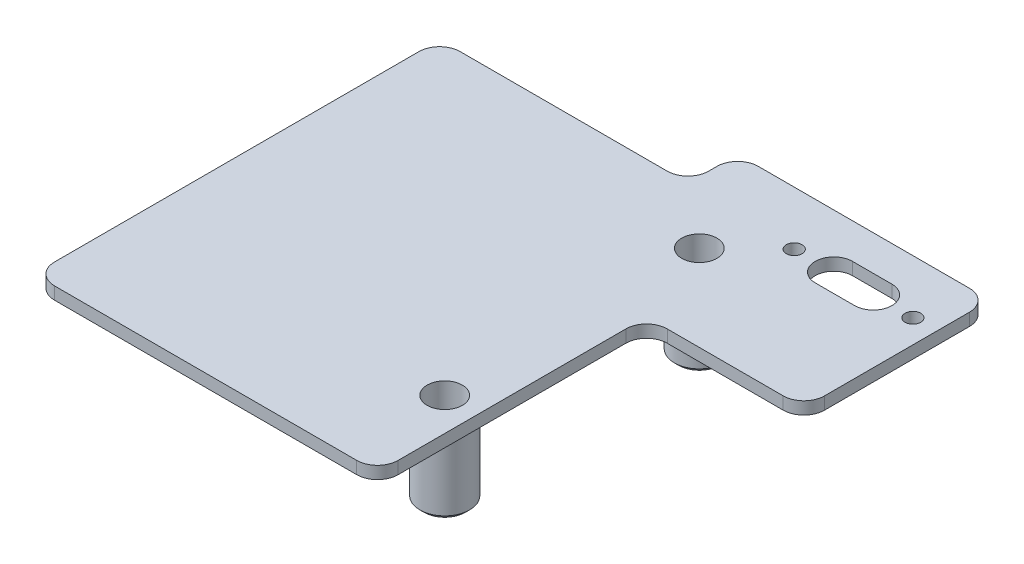
ISO-10303-21;
HEADER;
FILE_DESCRIPTION(('STEP AP214'),'2;1');
FILE_NAME('part.step','',(''),(''),'','','');
FILE_SCHEMA(('AUTOMOTIVE_DESIGN { 1 0 10303 214 1 1 1 1 }'));
ENDSEC;
DATA;
#1=APPLICATION_CONTEXT('core data for automotive mechanical design processes');
#2=APPLICATION_PROTOCOL_DEFINITION('international standard','automotive_design',2000,#1);
#3=PRODUCT_CONTEXT('',#1,'mechanical');
#4=PRODUCT('Part','Part','',(#3));
#5=PRODUCT_RELATED_PRODUCT_CATEGORY('part','',(#4));
#6=PRODUCT_DEFINITION_FORMATION('','',#4);
#7=PRODUCT_DEFINITION_CONTEXT('part definition',#1,'design');
#8=PRODUCT_DEFINITION('design','',#6,#7);
#9=PRODUCT_DEFINITION_SHAPE('','',#8);
#10=(LENGTH_UNIT() NAMED_UNIT(*) SI_UNIT(.MILLI.,.METRE.));
#11=(NAMED_UNIT(*) PLANE_ANGLE_UNIT() SI_UNIT($,.RADIAN.));
#12=(NAMED_UNIT(*) SI_UNIT($,.STERADIAN.) SOLID_ANGLE_UNIT());
#13=UNCERTAINTY_MEASURE_WITH_UNIT(LENGTH_MEASURE(1.E-05),#10,'distance_accuracy_value','');
#14=(GEOMETRIC_REPRESENTATION_CONTEXT(3) GLOBAL_UNCERTAINTY_ASSIGNED_CONTEXT((#13)) GLOBAL_UNIT_ASSIGNED_CONTEXT((#10,
#11,#12)) REPRESENTATION_CONTEXT('',''));
#15=CARTESIAN_POINT('',(0.,0.,0.));
#16=DIRECTION('',(0.,0.,1.));
#17=DIRECTION('',(1.,0.,0.));
#18=AXIS2_PLACEMENT_3D('',#15,#16,#17);
#19=CARTESIAN_POINT('',(0.,3.,-110.));
#20=DIRECTION('',(1.,0.,0.));
#21=DIRECTION('',(0.,0.,-1.));
#22=AXIS2_PLACEMENT_3D('',#19,#20,#21);
#23=PLANE('',#22);
#24=DIRECTION('',(0.,0.,1.));
#25=VECTOR('',#24,1.);
#26=CARTESIAN_POINT('',(0.,3.,-110.));
#27=LINE('',#26,#25);
#28=CARTESIAN_POINT('',(0.,3.,-93.));
#29=VERTEX_POINT('',#28);
#30=CARTESIAN_POINT('',(0.,3.,-5.));
#31=VERTEX_POINT('',#30);
#32=EDGE_CURVE('E229',#29,#31,#27,.T.);
#33=ORIENTED_EDGE('',*,*,#32,.F.);
#34=DIRECTION('',(0.,1.,0.));
#35=VECTOR('',#34,1.);
#36=CARTESIAN_POINT('',(0.,3.,-93.));
#37=LINE('',#36,#35);
#38=CARTESIAN_POINT('',(0.,0.,-93.));
#39=VERTEX_POINT('',#38);
#40=EDGE_CURVE('E57',#29,#39,#37,.F.);
#41=ORIENTED_EDGE('',*,*,#40,.T.);
#42=DIRECTION('',(0.,0.,1.));
#43=VECTOR('',#42,1.);
#44=CARTESIAN_POINT('',(0.,0.,-110.));
#45=LINE('',#44,#43);
#46=CARTESIAN_POINT('',(0.,0.,-5.));
#47=VERTEX_POINT('',#46);
#48=EDGE_CURVE('E226',#39,#47,#45,.T.);
#49=ORIENTED_EDGE('',*,*,#48,.T.);
#50=DIRECTION('',(0.,-1.,0.));
#51=VECTOR('',#50,1.);
#52=CARTESIAN_POINT('',(0.,3.,-5.));
#53=LINE('',#52,#51);
#54=EDGE_CURVE('E357',#47,#31,#53,.F.);
#55=ORIENTED_EDGE('',*,*,#54,.T.);
#56=EDGE_LOOP('',(#33,#41,#49,#55));
#57=FACE_BOUND('',#56,.T.);
#58=ADVANCED_FACE('F35',(#57),#23,.F.);
#59=CARTESIAN_POINT('',(0.,3.,0.));
#60=DIRECTION('',(0.,0.,-1.));
#61=DIRECTION('',(-1.,0.,0.));
#62=AXIS2_PLACEMENT_3D('',#59,#60,#61);
#63=PLANE('',#62);
#64=DIRECTION('',(1.,0.,0.));
#65=VECTOR('',#64,1.);
#66=CARTESIAN_POINT('',(0.,0.,0.));
#67=LINE('',#66,#65);
#68=CARTESIAN_POINT('',(5.,0.,0.));
#69=VERTEX_POINT('',#68);
#70=CARTESIAN_POINT('',(78.,0.,0.));
#71=VERTEX_POINT('',#70);
#72=EDGE_CURVE('E250',#69,#71,#67,.T.);
#73=ORIENTED_EDGE('',*,*,#72,.T.);
#74=DIRECTION('',(0.,-1.,0.));
#75=VECTOR('',#74,1.);
#76=CARTESIAN_POINT('',(78.,3.,0.));
#77=LINE('',#76,#75);
#78=CARTESIAN_POINT('',(78.,3.,0.));
#79=VERTEX_POINT('',#78);
#80=EDGE_CURVE('E378',#71,#79,#77,.F.);
#81=ORIENTED_EDGE('',*,*,#80,.T.);
#82=DIRECTION('',(1.,0.,0.));
#83=VECTOR('',#82,1.);
#84=CARTESIAN_POINT('',(0.,3.,0.));
#85=LINE('',#84,#83);
#86=CARTESIAN_POINT('',(5.,3.,0.));
#87=VERTEX_POINT('',#86);
#88=EDGE_CURVE('E232',#87,#79,#85,.T.);
#89=ORIENTED_EDGE('',*,*,#88,.F.);
#90=DIRECTION('',(0.,-1.,0.));
#91=VECTOR('',#90,1.);
#92=CARTESIAN_POINT('',(5.,3.,0.));
#93=LINE('',#92,#91);
#94=EDGE_CURVE('E375',#87,#69,#93,.T.);
#95=ORIENTED_EDGE('',*,*,#94,.T.);
#96=EDGE_LOOP('',(#73,#81,#89,#95));
#97=FACE_BOUND('',#96,.T.);
#98=ADVANCED_FACE('F468',(#97),#63,.F.);
#99=CARTESIAN_POINT('',(83.,3.,0.));
#100=DIRECTION('',(-1.,0.,0.));
#101=DIRECTION('',(0.,0.,1.));
#102=AXIS2_PLACEMENT_3D('',#99,#100,#101);
#103=PLANE('',#102);
#104=DIRECTION('',(0.,0.,-1.));
#105=VECTOR('',#104,1.);
#106=CARTESIAN_POINT('',(83.,0.,0.));
#107=LINE('',#106,#105);
#108=CARTESIAN_POINT('',(83.,0.,-5.));
#109=VERTEX_POINT('',#108);
#110=CARTESIAN_POINT('',(83.,0.,-60.));
#111=VERTEX_POINT('',#110);
#112=EDGE_CURVE('E253',#109,#111,#107,.T.);
#113=ORIENTED_EDGE('',*,*,#112,.T.);
#114=DIRECTION('',(0.,-1.,0.));
#115=VECTOR('',#114,1.);
#116=CARTESIAN_POINT('',(83.,3.,-60.));
#117=LINE('',#116,#115);
#118=CARTESIAN_POINT('',(83.,3.,-60.));
#119=VERTEX_POINT('',#118);
#120=EDGE_CURVE('E373',#111,#119,#117,.F.);
#121=ORIENTED_EDGE('',*,*,#120,.T.);
#122=DIRECTION('',(0.,0.,-1.));
#123=VECTOR('',#122,1.);
#124=CARTESIAN_POINT('',(83.,3.,0.));
#125=LINE('',#124,#123);
#126=CARTESIAN_POINT('',(83.,3.,-5.));
#127=VERTEX_POINT('',#126);
#128=EDGE_CURVE('E236',#127,#119,#125,.T.);
#129=ORIENTED_EDGE('',*,*,#128,.F.);
#130=DIRECTION('',(0.,-1.,0.));
#131=VECTOR('',#130,1.);
#132=CARTESIAN_POINT('',(83.,3.,-5.));
#133=LINE('',#132,#131);
#134=EDGE_CURVE('E370',#127,#109,#133,.T.);
#135=ORIENTED_EDGE('',*,*,#134,.T.);
#136=EDGE_LOOP('',(#113,#121,#129,#135));
#137=FACE_BOUND('',#136,.T.);
#138=ADVANCED_FACE('F460',(#137),#103,.F.);
#139=CARTESIAN_POINT('',(83.,3.,-65.));
#140=DIRECTION('',(0.,0.,-1.));
#141=DIRECTION('',(-1.,0.,0.));
#142=AXIS2_PLACEMENT_3D('',#139,#140,#141);
#143=PLANE('',#142);
#144=DIRECTION('',(1.,0.,0.));
#145=VECTOR('',#144,1.);
#146=CARTESIAN_POINT('',(83.,0.,-65.));
#147=LINE('',#146,#145);
#148=CARTESIAN_POINT('',(88.,0.,-65.));
#149=VERTEX_POINT('',#148);
#150=CARTESIAN_POINT('',(116.,0.,-65.));
#151=VERTEX_POINT('',#150);
#152=EDGE_CURVE('E256',#149,#151,#147,.T.);
#153=ORIENTED_EDGE('',*,*,#152,.T.);
#154=DIRECTION('',(0.,-1.,0.));
#155=VECTOR('',#154,1.);
#156=CARTESIAN_POINT('',(116.,3.,-65.));
#157=LINE('',#156,#155);
#158=CARTESIAN_POINT('',(116.,3.,-65.));
#159=VERTEX_POINT('',#158);
#160=EDGE_CURVE('E368',#151,#159,#157,.F.);
#161=ORIENTED_EDGE('',*,*,#160,.T.);
#162=DIRECTION('',(1.,0.,0.));
#163=VECTOR('',#162,1.);
#164=CARTESIAN_POINT('',(83.,3.,-65.));
#165=LINE('',#164,#163);
#166=CARTESIAN_POINT('',(88.,3.,-65.));
#167=VERTEX_POINT('',#166);
#168=EDGE_CURVE('E239',#167,#159,#165,.T.);
#169=ORIENTED_EDGE('',*,*,#168,.F.);
#170=DIRECTION('',(0.,-1.,0.));
#171=VECTOR('',#170,1.);
#172=CARTESIAN_POINT('',(88.,0.,-65.));
#173=LINE('',#172,#171);
#174=EDGE_CURVE('E365',#167,#149,#173,.T.);
#175=ORIENTED_EDGE('',*,*,#174,.T.);
#176=EDGE_LOOP('',(#153,#161,#169,#175));
#177=FACE_BOUND('',#176,.T.);
#178=ADVANCED_FACE('F451',(#177),#143,.F.);
#179=CARTESIAN_POINT('',(121.,3.,-65.));
#180=DIRECTION('',(-1.,0.,0.));
#181=DIRECTION('',(0.,0.,1.));
#182=AXIS2_PLACEMENT_3D('',#179,#180,#181);
#183=PLANE('',#182);
#184=DIRECTION('',(0.,0.,-1.));
#185=VECTOR('',#184,1.);
#186=CARTESIAN_POINT('',(121.,0.,-65.));
#187=LINE('',#186,#185);
#188=CARTESIAN_POINT('',(121.,0.,-70.));
#189=VERTEX_POINT('',#188);
#190=CARTESIAN_POINT('',(121.,0.,-105.));
#191=VERTEX_POINT('',#190);
#192=EDGE_CURVE('E259',#189,#191,#187,.T.);
#193=ORIENTED_EDGE('',*,*,#192,.T.);
#194=DIRECTION('',(0.,-1.,0.));
#195=VECTOR('',#194,1.);
#196=CARTESIAN_POINT('',(121.,3.,-105.));
#197=LINE('',#196,#195);
#198=CARTESIAN_POINT('',(121.,3.,-105.));
#199=VERTEX_POINT('',#198);
#200=EDGE_CURVE('E363',#191,#199,#197,.F.);
#201=ORIENTED_EDGE('',*,*,#200,.T.);
#202=DIRECTION('',(0.,0.,-1.));
#203=VECTOR('',#202,1.);
#204=CARTESIAN_POINT('',(121.,3.,-65.));
#205=LINE('',#204,#203);
#206=CARTESIAN_POINT('',(121.,3.,-70.));
#207=VERTEX_POINT('',#206);
#208=EDGE_CURVE('E242',#207,#199,#205,.T.);
#209=ORIENTED_EDGE('',*,*,#208,.F.);
#210=DIRECTION('',(0.,-1.,0.));
#211=VECTOR('',#210,1.);
#212=CARTESIAN_POINT('',(121.,3.,-70.));
#213=LINE('',#212,#211);
#214=EDGE_CURVE('E360',#207,#189,#213,.T.);
#215=ORIENTED_EDGE('',*,*,#214,.T.);
#216=EDGE_LOOP('',(#193,#201,#209,#215));
#217=FACE_BOUND('',#216,.T.);
#218=ADVANCED_FACE('F443',(#217),#183,.F.);
#219=CARTESIAN_POINT('',(121.,3.,-110.));
#220=DIRECTION('',(0.,0.,1.));
#221=DIRECTION('',(1.,0.,0.));
#222=AXIS2_PLACEMENT_3D('',#219,#220,#221);
#223=PLANE('',#222);
#224=DIRECTION('',(-1.,0.,0.));
#225=VECTOR('',#224,1.);
#226=CARTESIAN_POINT('',(121.,0.,-110.));
#227=LINE('',#226,#225);
#228=CARTESIAN_POINT('',(116.,0.,-110.));
#229=VERTEX_POINT('',#228);
#230=CARTESIAN_POINT('',(65.,0.,-110.));
#231=VERTEX_POINT('',#230);
#232=EDGE_CURVE('E233',#229,#231,#227,.T.);
#233=ORIENTED_EDGE('',*,*,#232,.T.);
#234=DIRECTION('',(0.,1.,0.));
#235=VECTOR('',#234,1.);
#236=CARTESIAN_POINT('',(65.,3.,-110.));
#237=LINE('',#236,#235);
#238=CARTESIAN_POINT('',(65.,3.,-110.));
#239=VERTEX_POINT('',#238);
#240=EDGE_CURVE('E321',#231,#239,#237,.T.);
#241=ORIENTED_EDGE('',*,*,#240,.T.);
#242=DIRECTION('',(-1.,0.,0.));
#243=VECTOR('',#242,1.);
#244=CARTESIAN_POINT('',(121.,3.,-110.));
#245=LINE('',#244,#243);
#246=CARTESIAN_POINT('',(116.,3.,-110.));
#247=VERTEX_POINT('',#246);
#248=EDGE_CURVE('E245',#247,#239,#245,.T.);
#249=ORIENTED_EDGE('',*,*,#248,.F.);
#250=DIRECTION('',(0.,-1.,0.));
#251=VECTOR('',#250,1.);
#252=CARTESIAN_POINT('',(116.,3.,-110.));
#253=LINE('',#252,#251);
#254=EDGE_CURVE('E318',#247,#229,#253,.T.);
#255=ORIENTED_EDGE('',*,*,#254,.T.);
#256=EDGE_LOOP('',(#233,#241,#249,#255));
#257=FACE_BOUND('',#256,.T.);
#258=ADVANCED_FACE('F430',(#257),#223,.F.);
#259=CARTESIAN_POINT('',(0.,3.,0.));
#260=DIRECTION('',(0.,1.,0.));
#261=DIRECTION('',(0.,0.,1.));
#262=AXIS2_PLACEMENT_3D('',#259,#260,#261);
#263=PLANE('',#262);
#264=ORIENTED_EDGE('',*,*,#248,.T.);
#265=CARTESIAN_POINT('',(65.,3.,-105.));
#266=DIRECTION('',(0.,1.,0.));
#267=DIRECTION('',(0.,0.,1.));
#268=AXIS2_PLACEMENT_3D('',#265,#266,#267);
#269=CIRCLE('',#268,5.);
#270=CARTESIAN_POINT('',(60.,3.,-105.));
#271=VERTEX_POINT('',#270);
#272=EDGE_CURVE('E334',#239,#271,#269,.T.);
#273=ORIENTED_EDGE('',*,*,#272,.T.);
#274=DIRECTION('',(0.,0.,-1.));
#275=VECTOR('',#274,1.);
#276=CARTESIAN_POINT('',(60.,3.,-98.));
#277=LINE('',#276,#275);
#278=CARTESIAN_POINT('',(60.,3.,-103.));
#279=VERTEX_POINT('',#278);
#280=EDGE_CURVE('E488',#279,#271,#277,.T.);
#281=ORIENTED_EDGE('',*,*,#280,.F.);
#282=CARTESIAN_POINT('',(55.,3.,-103.));
#283=DIRECTION('',(0.,1.,0.));
#284=DIRECTION('',(0.,0.,1.));
#285=AXIS2_PLACEMENT_3D('',#282,#283,#284);
#286=CIRCLE('',#285,5.);
#287=CARTESIAN_POINT('',(55.,3.,-98.));
#288=VERTEX_POINT('',#287);
#289=EDGE_CURVE('E380',#279,#288,#286,.F.);
#290=ORIENTED_EDGE('',*,*,#289,.T.);
#291=DIRECTION('',(1.,0.,0.));
#292=VECTOR('',#291,1.);
#293=CARTESIAN_POINT('',(0.,3.,-98.));
#294=LINE('',#293,#292);
#295=CARTESIAN_POINT('',(4.99999999999999,3.,-98.));
#296=VERTEX_POINT('',#295);
#297=EDGE_CURVE('E476',#296,#288,#294,.T.);
#298=ORIENTED_EDGE('',*,*,#297,.F.);
#299=CARTESIAN_POINT('',(4.99999999999999,3.,-93.));
#300=DIRECTION('',(0.,1.,0.));
#301=DIRECTION('',(0.,0.,1.));
#302=AXIS2_PLACEMENT_3D('',#299,#300,#301);
#303=CIRCLE('',#302,5.);
#304=EDGE_CURVE('E332',#296,#29,#303,.T.);
#305=ORIENTED_EDGE('',*,*,#304,.T.);
#306=ORIENTED_EDGE('',*,*,#32,.T.);
#307=CARTESIAN_POINT('',(5.,3.,-5.));
#308=DIRECTION('',(0.,1.,0.));
#309=DIRECTION('',(0.,0.,1.));
#310=AXIS2_PLACEMENT_3D('',#307,#308,#309);
#311=CIRCLE('',#310,5.);
#312=EDGE_CURVE('E324',#31,#87,#311,.T.);
#313=ORIENTED_EDGE('',*,*,#312,.T.);
#314=ORIENTED_EDGE('',*,*,#88,.T.);
#315=CARTESIAN_POINT('',(78.,3.,-5.));
#316=DIRECTION('',(0.,1.,0.));
#317=DIRECTION('',(0.,0.,1.));
#318=AXIS2_PLACEMENT_3D('',#315,#316,#317);
#319=CIRCLE('',#318,5.);
#320=EDGE_CURVE('E326',#79,#127,#319,.T.);
#321=ORIENTED_EDGE('',*,*,#320,.T.);
#322=ORIENTED_EDGE('',*,*,#128,.T.);
#323=CARTESIAN_POINT('',(88.,3.,-60.));
#324=DIRECTION('',(0.,1.,0.));
#325=DIRECTION('',(0.,0.,1.));
#326=AXIS2_PLACEMENT_3D('',#323,#324,#325);
#327=CIRCLE('',#326,5.);
#328=EDGE_CURVE('E386',#119,#167,#327,.F.);
#329=ORIENTED_EDGE('',*,*,#328,.T.);
#330=ORIENTED_EDGE('',*,*,#168,.T.);
#331=CARTESIAN_POINT('',(116.,3.,-70.));
#332=DIRECTION('',(0.,1.,0.));
#333=DIRECTION('',(0.,0.,1.));
#334=AXIS2_PLACEMENT_3D('',#331,#332,#333);
#335=CIRCLE('',#334,5.);
#336=EDGE_CURVE('E328',#159,#207,#335,.T.);
#337=ORIENTED_EDGE('',*,*,#336,.T.);
#338=ORIENTED_EDGE('',*,*,#208,.T.);
#339=CARTESIAN_POINT('',(116.,3.,-105.));
#340=DIRECTION('',(0.,1.,0.));
#341=DIRECTION('',(0.,0.,1.));
#342=AXIS2_PLACEMENT_3D('',#339,#340,#341);
#343=CIRCLE('',#342,5.);
#344=EDGE_CURVE('E330',#199,#247,#343,.T.);
#345=ORIENTED_EDGE('',*,*,#344,.T.);
#346=EDGE_LOOP('',(#264,#273,#281,#290,#298,#305,#306,#313,#314,#321,#322,#329,#330,#337,#338,#345));
#347=FACE_BOUND('',#346,.T.);
#348=CARTESIAN_POINT('',(86.66,3.,-97.));
#349=DIRECTION('',(0.,1.,0.));
#350=DIRECTION('',(0.,0.,1.));
#351=AXIS2_PLACEMENT_3D('',#348,#349,#350);
#352=CIRCLE('',#351,1.9);
#353=CARTESIAN_POINT('',(86.66,3.,-95.1));
#354=VERTEX_POINT('',#353);
#355=EDGE_CURVE('E489',#354,#354,#352,.T.);
#356=ORIENTED_EDGE('',*,*,#355,.F.);
#357=EDGE_LOOP('',(#356));
#358=FACE_BOUND('',#357,.T.);
#359=CARTESIAN_POINT('',(115.34,3.,-97.));
#360=DIRECTION('',(0.,1.,0.));
#361=DIRECTION('',(0.,0.,1.));
#362=AXIS2_PLACEMENT_3D('',#359,#360,#361);
#363=CIRCLE('',#362,1.9);
#364=CARTESIAN_POINT('',(115.34,3.,-95.1));
#365=VERTEX_POINT('',#364);
#366=EDGE_CURVE('E492',#365,#365,#363,.T.);
#367=ORIENTED_EDGE('',*,*,#366,.F.);
#368=EDGE_LOOP('',(#367));
#369=FACE_BOUND('',#368,.T.);
#370=CARTESIAN_POINT('',(96.2375,3.,-97.));
#371=DIRECTION('',(0.,1.,0.));
#372=DIRECTION('',(0.,0.,1.));
#373=AXIS2_PLACEMENT_3D('',#370,#371,#372);
#374=CIRCLE('',#373,4.5);
#375=CARTESIAN_POINT('',(96.2375,3.,-101.5));
#376=VERTEX_POINT('',#375);
#377=CARTESIAN_POINT('',(96.2375,3.,-92.5));
#378=VERTEX_POINT('',#377);
#379=EDGE_CURVE('E194',#376,#378,#374,.T.);
#380=ORIENTED_EDGE('',*,*,#379,.F.);
#381=DIRECTION('',(-1.,0.,0.));
#382=VECTOR('',#381,1.);
#383=CARTESIAN_POINT('',(96.2375,3.,-101.5));
#384=LINE('',#383,#382);
#385=CARTESIAN_POINT('',(105.7625,3.,-101.5));
#386=VERTEX_POINT('',#385);
#387=EDGE_CURVE('E199',#386,#376,#384,.T.);
#388=ORIENTED_EDGE('',*,*,#387,.F.);
#389=CARTESIAN_POINT('',(105.7625,3.,-97.));
#390=DIRECTION('',(0.,1.,0.));
#391=DIRECTION('',(0.,0.,-1.));
#392=AXIS2_PLACEMENT_3D('',#389,#390,#391);
#393=CIRCLE('',#392,4.5);
#394=CARTESIAN_POINT('',(105.7625,3.,-92.5));
#395=VERTEX_POINT('',#394);
#396=EDGE_CURVE('E178',#395,#386,#393,.T.);
#397=ORIENTED_EDGE('',*,*,#396,.F.);
#398=DIRECTION('',(1.,0.,0.));
#399=VECTOR('',#398,1.);
#400=CARTESIAN_POINT('',(96.2375,3.,-92.5));
#401=LINE('',#400,#399);
#402=EDGE_CURVE('E189',#378,#395,#401,.T.);
#403=ORIENTED_EDGE('',*,*,#402,.F.);
#404=EDGE_LOOP('',(#380,#388,#397,#403));
#405=FACE_BOUND('',#404,.T.);
#406=CARTESIAN_POINT('',(75.,3.,-85.75));
#407=DIRECTION('',(0.,1.,0.));
#408=DIRECTION('',(0.,0.,1.));
#409=AXIS2_PLACEMENT_3D('',#406,#407,#408);
#410=CIRCLE('',#409,4.25000000000001);
#411=CARTESIAN_POINT('',(75.,3.,-81.5));
#412=VERTEX_POINT('',#411);
#413=EDGE_CURVE('E223',#412,#412,#410,.T.);
#414=ORIENTED_EDGE('',*,*,#413,.F.);
#415=EDGE_LOOP('',(#414));
#416=FACE_BOUND('',#415,.T.);
#417=CARTESIAN_POINT('',(75.,3.,-24.25));
#418=DIRECTION('',(0.,1.,0.));
#419=DIRECTION('',(0.,0.,1.));
#420=AXIS2_PLACEMENT_3D('',#417,#418,#419);
#421=CIRCLE('',#420,4.25);
#422=CARTESIAN_POINT('',(75.,3.,-20.));
#423=VERTEX_POINT('',#422);
#424=EDGE_CURVE('E222',#423,#423,#421,.T.);
#425=ORIENTED_EDGE('',*,*,#424,.F.);
#426=EDGE_LOOP('',(#425));
#427=FACE_BOUND('',#426,.T.);
#428=ADVANCED_FACE('F196',(#347,#358,#369,#405,#416,#427),#263,.T.);
#429=CARTESIAN_POINT('',(0.,0.,0.));
#430=DIRECTION('',(0.,1.,0.));
#431=DIRECTION('',(0.,0.,1.));
#432=AXIS2_PLACEMENT_3D('',#429,#430,#431);
#433=PLANE('',#432);
#434=CARTESIAN_POINT('',(75.,0.,-85.75));
#435=DIRECTION('',(0.,1.,0.));
#436=DIRECTION('',(0.,0.,1.));
#437=AXIS2_PLACEMENT_3D('',#434,#435,#436);
#438=CIRCLE('',#437,7.5);
#439=CARTESIAN_POINT('',(75.,0.,-78.25));
#440=VERTEX_POINT('',#439);
#441=EDGE_CURVE('E391',#440,#440,#438,.T.);
#442=ORIENTED_EDGE('',*,*,#441,.T.);
#443=EDGE_LOOP('',(#442));
#444=FACE_BOUND('',#443,.T.);
#445=CARTESIAN_POINT('',(75.,0.,-24.25));
#446=DIRECTION('',(0.,1.,0.));
#447=DIRECTION('',(0.,0.,1.));
#448=AXIS2_PLACEMENT_3D('',#445,#446,#447);
#449=CIRCLE('',#448,7.5);
#450=CARTESIAN_POINT('',(75.,0.,-16.75));
#451=VERTEX_POINT('',#450);
#452=EDGE_CURVE('E388',#451,#451,#449,.T.);
#453=ORIENTED_EDGE('',*,*,#452,.T.);
#454=EDGE_LOOP('',(#453));
#455=FACE_BOUND('',#454,.T.);
#456=CARTESIAN_POINT('',(86.66,0.,-97.));
#457=DIRECTION('',(0.,1.,0.));
#458=DIRECTION('',(0.,0.,1.));
#459=AXIS2_PLACEMENT_3D('',#456,#457,#458);
#460=CIRCLE('',#459,1.9);
#461=CARTESIAN_POINT('',(86.66,0.,-95.1));
#462=VERTEX_POINT('',#461);
#463=EDGE_CURVE('E213',#462,#462,#460,.T.);
#464=ORIENTED_EDGE('',*,*,#463,.T.);
#465=EDGE_LOOP('',(#464));
#466=FACE_BOUND('',#465,.T.);
#467=CARTESIAN_POINT('',(115.34,0.,-97.));
#468=DIRECTION('',(0.,1.,0.));
#469=DIRECTION('',(0.,0.,1.));
#470=AXIS2_PLACEMENT_3D('',#467,#468,#469);
#471=CIRCLE('',#470,1.9);
#472=CARTESIAN_POINT('',(115.34,0.,-95.1));
#473=VERTEX_POINT('',#472);
#474=EDGE_CURVE('E206',#473,#473,#471,.T.);
#475=ORIENTED_EDGE('',*,*,#474,.T.);
#476=EDGE_LOOP('',(#475));
#477=FACE_BOUND('',#476,.T.);
#478=DIRECTION('',(-1.,0.,0.));
#479=VECTOR('',#478,1.);
#480=CARTESIAN_POINT('',(0.,0.,-101.5));
#481=LINE('',#480,#479);
#482=CARTESIAN_POINT('',(105.7625,0.,-101.5));
#483=VERTEX_POINT('',#482);
#484=CARTESIAN_POINT('',(96.2375,0.,-101.5));
#485=VERTEX_POINT('',#484);
#486=EDGE_CURVE('E278',#483,#485,#481,.T.);
#487=ORIENTED_EDGE('',*,*,#486,.T.);
#488=CARTESIAN_POINT('',(96.2375,0.,-97.));
#489=DIRECTION('',(0.,1.,0.));
#490=DIRECTION('',(0.,0.,1.));
#491=AXIS2_PLACEMENT_3D('',#488,#489,#490);
#492=CIRCLE('',#491,4.5);
#493=CARTESIAN_POINT('',(96.2375,0.,-92.5));
#494=VERTEX_POINT('',#493);
#495=EDGE_CURVE('E281',#485,#494,#492,.T.);
#496=ORIENTED_EDGE('',*,*,#495,.T.);
#497=DIRECTION('',(1.,0.,0.));
#498=VECTOR('',#497,1.);
#499=CARTESIAN_POINT('',(1.34771167687437E-13,0.,-92.5000000000002));
#500=LINE('',#499,#498);
#501=CARTESIAN_POINT('',(105.7625,0.,-92.5));
#502=VERTEX_POINT('',#501);
#503=EDGE_CURVE('E275',#494,#502,#500,.T.);
#504=ORIENTED_EDGE('',*,*,#503,.T.);
#505=CARTESIAN_POINT('',(105.7625,0.,-97.));
#506=DIRECTION('',(0.,1.,0.));
#507=DIRECTION('',(0.,0.,1.));
#508=AXIS2_PLACEMENT_3D('',#505,#506,#507);
#509=CIRCLE('',#508,4.5);
#510=EDGE_CURVE('E181',#502,#483,#509,.T.);
#511=ORIENTED_EDGE('',*,*,#510,.T.);
#512=EDGE_LOOP('',(#487,#496,#504,#511));
#513=FACE_BOUND('',#512,.T.);
#514=CARTESIAN_POINT('',(42.,0.,-55.));
#515=DIRECTION('',(0.,1.,0.));
#516=DIRECTION('',(0.,0.,1.));
#517=AXIS2_PLACEMENT_3D('',#514,#515,#516);
#518=CIRCLE('',#517,8.24867050912094);
#519=CARTESIAN_POINT('',(42.,0.,-46.7513294908791));
#520=VERTEX_POINT('',#519);
#521=EDGE_CURVE('E269',#520,#520,#518,.T.);
#522=ORIENTED_EDGE('',*,*,#521,.T.);
#523=EDGE_LOOP('',(#522));
#524=FACE_BOUND('',#523,.T.);
#525=DIRECTION('',(0.,0.,-1.));
#526=VECTOR('',#525,1.);
#527=CARTESIAN_POINT('',(60.,0.,0.));
#528=LINE('',#527,#526);
#529=CARTESIAN_POINT('',(60.,0.,-103.));
#530=VERTEX_POINT('',#529);
#531=CARTESIAN_POINT('',(60.,0.,-105.));
#532=VERTEX_POINT('',#531);
#533=EDGE_CURVE('E291',#530,#532,#528,.T.);
#534=ORIENTED_EDGE('',*,*,#533,.T.);
#535=CARTESIAN_POINT('',(65.,0.,-105.));
#536=DIRECTION('',(0.,1.,0.));
#537=DIRECTION('',(0.,0.,1.));
#538=AXIS2_PLACEMENT_3D('',#535,#536,#537);
#539=CIRCLE('',#538,5.);
#540=EDGE_CURVE('E350',#532,#231,#539,.F.);
#541=ORIENTED_EDGE('',*,*,#540,.T.);
#542=ORIENTED_EDGE('',*,*,#232,.F.);
#543=CARTESIAN_POINT('',(116.,0.,-105.));
#544=DIRECTION('',(0.,1.,0.));
#545=DIRECTION('',(0.,0.,1.));
#546=AXIS2_PLACEMENT_3D('',#543,#544,#545);
#547=CIRCLE('',#546,5.);
#548=EDGE_CURVE('E346',#229,#191,#547,.F.);
#549=ORIENTED_EDGE('',*,*,#548,.T.);
#550=ORIENTED_EDGE('',*,*,#192,.F.);
#551=CARTESIAN_POINT('',(116.,0.,-70.));
#552=DIRECTION('',(0.,1.,0.));
#553=DIRECTION('',(0.,0.,1.));
#554=AXIS2_PLACEMENT_3D('',#551,#552,#553);
#555=CIRCLE('',#554,5.);
#556=EDGE_CURVE('E344',#189,#151,#555,.F.);
#557=ORIENTED_EDGE('',*,*,#556,.T.);
#558=ORIENTED_EDGE('',*,*,#152,.F.);
#559=CARTESIAN_POINT('',(88.,0.,-60.));
#560=DIRECTION('',(0.,1.,0.));
#561=DIRECTION('',(0.,0.,1.));
#562=AXIS2_PLACEMENT_3D('',#559,#560,#561);
#563=CIRCLE('',#562,5.);
#564=EDGE_CURVE('E384',#149,#111,#563,.T.);
#565=ORIENTED_EDGE('',*,*,#564,.T.);
#566=ORIENTED_EDGE('',*,*,#112,.F.);
#567=CARTESIAN_POINT('',(78.,0.,-5.));
#568=DIRECTION('',(0.,1.,0.));
#569=DIRECTION('',(0.,0.,1.));
#570=AXIS2_PLACEMENT_3D('',#567,#568,#569);
#571=CIRCLE('',#570,5.);
#572=EDGE_CURVE('E342',#109,#71,#571,.F.);
#573=ORIENTED_EDGE('',*,*,#572,.T.);
#574=ORIENTED_EDGE('',*,*,#72,.F.);
#575=CARTESIAN_POINT('',(5.,0.,-5.));
#576=DIRECTION('',(0.,1.,0.));
#577=DIRECTION('',(0.,0.,1.));
#578=AXIS2_PLACEMENT_3D('',#575,#576,#577);
#579=CIRCLE('',#578,5.);
#580=EDGE_CURVE('E50',#69,#47,#579,.F.);
#581=ORIENTED_EDGE('',*,*,#580,.T.);
#582=ORIENTED_EDGE('',*,*,#48,.F.);
#583=CARTESIAN_POINT('',(4.99999999999999,0.,-93.));
#584=DIRECTION('',(0.,1.,0.));
#585=DIRECTION('',(0.,0.,1.));
#586=AXIS2_PLACEMENT_3D('',#583,#584,#585);
#587=CIRCLE('',#586,5.);
#588=CARTESIAN_POINT('',(4.99999999999999,0.,-98.));
#589=VERTEX_POINT('',#588);
#590=EDGE_CURVE('E348',#39,#589,#587,.F.);
#591=ORIENTED_EDGE('',*,*,#590,.T.);
#592=DIRECTION('',(1.,0.,0.));
#593=VECTOR('',#592,1.);
#594=CARTESIAN_POINT('',(0.,0.,-98.));
#595=LINE('',#594,#593);
#596=CARTESIAN_POINT('',(55.,0.,-98.));
#597=VERTEX_POINT('',#596);
#598=EDGE_CURVE('E284',#589,#597,#595,.T.);
#599=ORIENTED_EDGE('',*,*,#598,.T.);
#600=CARTESIAN_POINT('',(55.,0.,-103.));
#601=DIRECTION('',(0.,1.,0.));
#602=DIRECTION('',(0.,0.,1.));
#603=AXIS2_PLACEMENT_3D('',#600,#601,#602);
#604=CIRCLE('',#603,5.);
#605=EDGE_CURVE('E382',#597,#530,#604,.T.);
#606=ORIENTED_EDGE('',*,*,#605,.T.);
#607=EDGE_LOOP('',(#534,#541,#542,#549,#550,#557,#558,#565,#566,#573,#574,#581,#582,#591,#599,#606));
#608=FACE_BOUND('',#607,.T.);
#609=ADVANCED_FACE('F405',(#444,#455,#466,#477,#513,#524,#608),#433,.F.);
#610=CARTESIAN_POINT('',(75.,-19.,-85.75));
#611=DIRECTION('',(0.,1.,0.));
#612=DIRECTION('',(0.,0.,1.));
#613=AXIS2_PLACEMENT_3D('',#610,#611,#612);
#614=CYLINDRICAL_SURFACE('',#613,6.);
#615=CARTESIAN_POINT('',(75.,-1.5,-85.75));
#616=DIRECTION('',(0.,1.,0.));
#617=DIRECTION('',(0.,0.,1.));
#618=AXIS2_PLACEMENT_3D('',#615,#616,#617);
#619=CIRCLE('',#618,6.);
#620=CARTESIAN_POINT('',(75.,-1.5,-79.75));
#621=VERTEX_POINT('',#620);
#622=EDGE_CURVE('E43',#621,#621,#619,.F.);
#623=ORIENTED_EDGE('',*,*,#622,.T.);
#624=EDGE_LOOP('',(#623));
#625=FACE_BOUND('',#624,.T.);
#626=CARTESIAN_POINT('',(75.,-18.,-85.75));
#627=DIRECTION('',(0.,1.,0.));
#628=DIRECTION('',(0.,0.,1.));
#629=AXIS2_PLACEMENT_3D('',#626,#627,#628);
#630=CIRCLE('',#629,6.);
#631=CARTESIAN_POINT('',(75.,-18.,-79.75));
#632=VERTEX_POINT('',#631);
#633=EDGE_CURVE('E312',#632,#632,#630,.T.);
#634=ORIENTED_EDGE('',*,*,#633,.T.);
#635=EDGE_LOOP('',(#634));
#636=FACE_BOUND('',#635,.T.);
#637=ADVANCED_FACE('F396',(#625,#636),#614,.T.);
#638=CARTESIAN_POINT('',(75.,-19.,-85.75));
#639=DIRECTION('',(0.,1.,0.));
#640=DIRECTION('',(0.,0.,1.));
#641=AXIS2_PLACEMENT_3D('',#638,#639,#640);
#642=PLANE('',#641);
#643=CARTESIAN_POINT('',(75.,-19.,-85.75));
#644=DIRECTION('',(0.,1.,0.));
#645=DIRECTION('',(0.,0.,1.));
#646=AXIS2_PLACEMENT_3D('',#643,#644,#645);
#647=CIRCLE('',#646,4.99999999999999);
#648=CARTESIAN_POINT('',(75.,-19.,-80.75));
#649=VERTEX_POINT('',#648);
#650=EDGE_CURVE('E315',#649,#649,#647,.F.);
#651=ORIENTED_EDGE('',*,*,#650,.T.);
#652=EDGE_LOOP('',(#651));
#653=FACE_BOUND('',#652,.T.);
#654=CARTESIAN_POINT('',(75.,-19.,-85.75));
#655=DIRECTION('',(0.,1.,0.));
#656=DIRECTION('',(0.,0.,1.));
#657=AXIS2_PLACEMENT_3D('',#654,#655,#656);
#658=CIRCLE('',#657,2.2479);
#659=CARTESIAN_POINT('',(75.,-19.,-83.5021));
#660=VERTEX_POINT('',#659);
#661=EDGE_CURVE('E216',#660,#660,#658,.T.);
#662=ORIENTED_EDGE('',*,*,#661,.T.);
#663=EDGE_LOOP('',(#662));
#664=FACE_BOUND('',#663,.T.);
#665=ADVANCED_FACE('F797',(#653,#664),#642,.F.);
#666=CARTESIAN_POINT('',(75.,-19.,-24.25));
#667=DIRECTION('',(0.,1.,0.));
#668=DIRECTION('',(0.,0.,1.));
#669=AXIS2_PLACEMENT_3D('',#666,#667,#668);
#670=CYLINDRICAL_SURFACE('',#669,6.);
#671=CARTESIAN_POINT('',(75.,-1.5,-24.25));
#672=DIRECTION('',(0.,1.,0.));
#673=DIRECTION('',(0.,0.,1.));
#674=AXIS2_PLACEMENT_3D('',#671,#672,#673);
#675=CIRCLE('',#674,6.);
#676=CARTESIAN_POINT('',(75.,-1.5,-18.25));
#677=VERTEX_POINT('',#676);
#678=EDGE_CURVE('E11',#677,#677,#675,.F.);
#679=ORIENTED_EDGE('',*,*,#678,.T.);
#680=EDGE_LOOP('',(#679));
#681=FACE_BOUND('',#680,.T.);
#682=CARTESIAN_POINT('',(75.,-18.,-24.25));
#683=DIRECTION('',(0.,1.,0.));
#684=DIRECTION('',(0.,0.,1.));
#685=AXIS2_PLACEMENT_3D('',#682,#683,#684);
#686=CIRCLE('',#685,6.);
#687=CARTESIAN_POINT('',(75.,-18.,-18.25));
#688=VERTEX_POINT('',#687);
#689=EDGE_CURVE('E306',#688,#688,#686,.T.);
#690=ORIENTED_EDGE('',*,*,#689,.T.);
#691=EDGE_LOOP('',(#690));
#692=FACE_BOUND('',#691,.T.);
#693=ADVANCED_FACE('F789',(#681,#692),#670,.T.);
#694=CARTESIAN_POINT('',(75.,-19.,-24.25));
#695=DIRECTION('',(0.,1.,0.));
#696=DIRECTION('',(0.,0.,1.));
#697=AXIS2_PLACEMENT_3D('',#694,#695,#696);
#698=PLANE('',#697);
#699=CARTESIAN_POINT('',(75.,-19.,-24.25));
#700=DIRECTION('',(0.,1.,0.));
#701=DIRECTION('',(0.,0.,1.));
#702=AXIS2_PLACEMENT_3D('',#699,#700,#701);
#703=CIRCLE('',#702,4.99999999999999);
#704=CARTESIAN_POINT('',(75.,-19.,-19.25));
#705=VERTEX_POINT('',#704);
#706=EDGE_CURVE('E309',#705,#705,#703,.F.);
#707=ORIENTED_EDGE('',*,*,#706,.T.);
#708=EDGE_LOOP('',(#707));
#709=FACE_BOUND('',#708,.T.);
#710=CARTESIAN_POINT('',(75.,-19.,-24.25));
#711=DIRECTION('',(0.,1.,0.));
#712=DIRECTION('',(0.,0.,1.));
#713=AXIS2_PLACEMENT_3D('',#710,#711,#712);
#714=CIRCLE('',#713,2.2479);
#715=CARTESIAN_POINT('',(75.,-19.,-22.0021));
#716=VERTEX_POINT('',#715);
#717=EDGE_CURVE('E219',#716,#716,#714,.T.);
#718=ORIENTED_EDGE('',*,*,#717,.T.);
#719=EDGE_LOOP('',(#718));
#720=FACE_BOUND('',#719,.T.);
#721=ADVANCED_FACE('F781',(#709,#720),#698,.F.);
#722=CARTESIAN_POINT('',(75.,-16.5,-24.25));
#723=DIRECTION('',(0.,1.,0.));
#724=DIRECTION('',(0.,0.,1.));
#725=AXIS2_PLACEMENT_3D('',#722,#723,#724);
#726=CYLINDRICAL_SURFACE('',#725,4.25);
#727=CARTESIAN_POINT('',(75.,-13.5,-24.25));
#728=DIRECTION('',(0.,1.,0.));
#729=DIRECTION('',(0.,0.,1.));
#730=AXIS2_PLACEMENT_3D('',#727,#728,#729);
#731=CIRCLE('',#730,4.25);
#732=CARTESIAN_POINT('',(75.,-13.5,-20.));
#733=VERTEX_POINT('',#732);
#734=EDGE_CURVE('E297',#733,#733,#731,.F.);
#735=ORIENTED_EDGE('',*,*,#734,.T.);
#736=EDGE_LOOP('',(#735));
#737=FACE_BOUND('',#736,.T.);
#738=ORIENTED_EDGE('',*,*,#424,.T.);
#739=EDGE_LOOP('',(#738));
#740=FACE_BOUND('',#739,.T.);
#741=ADVANCED_FACE('F773',(#737,#740),#726,.F.);
#742=CARTESIAN_POINT('',(75.,-16.5,-85.75));
#743=DIRECTION('',(0.,1.,0.));
#744=DIRECTION('',(0.,0.,1.));
#745=AXIS2_PLACEMENT_3D('',#742,#743,#744);
#746=CYLINDRICAL_SURFACE('',#745,4.25000000000001);
#747=CARTESIAN_POINT('',(75.,-13.5,-85.75));
#748=DIRECTION('',(0.,1.,0.));
#749=DIRECTION('',(0.,0.,1.));
#750=AXIS2_PLACEMENT_3D('',#747,#748,#749);
#751=CIRCLE('',#750,4.25000000000001);
#752=CARTESIAN_POINT('',(75.,-13.5,-81.5));
#753=VERTEX_POINT('',#752);
#754=EDGE_CURVE('E294',#753,#753,#751,.F.);
#755=ORIENTED_EDGE('',*,*,#754,.T.);
#756=EDGE_LOOP('',(#755));
#757=FACE_BOUND('',#756,.T.);
#758=ORIENTED_EDGE('',*,*,#413,.T.);
#759=EDGE_LOOP('',(#758));
#760=FACE_BOUND('',#759,.T.);
#761=ADVANCED_FACE('F764',(#757,#760),#746,.F.);
#762=CARTESIAN_POINT('',(75.,-16.5,-24.25));
#763=DIRECTION('',(0.,1.,0.));
#764=DIRECTION('',(0.,0.,1.));
#765=AXIS2_PLACEMENT_3D('',#762,#763,#764);
#766=CYLINDRICAL_SURFACE('',#765,2.2479);
#767=CARTESIAN_POINT('',(75.,-15.5021,-24.25));
#768=DIRECTION('',(0.,1.,0.));
#769=DIRECTION('',(0.,0.,1.));
#770=AXIS2_PLACEMENT_3D('',#767,#768,#769);
#771=CIRCLE('',#770,2.2479);
#772=CARTESIAN_POINT('',(75.,-15.5021,-22.0021));
#773=VERTEX_POINT('',#772);
#774=EDGE_CURVE('E303',#773,#773,#771,.T.);
#775=ORIENTED_EDGE('',*,*,#774,.T.);
#776=EDGE_LOOP('',(#775));
#777=FACE_BOUND('',#776,.T.);
#778=ORIENTED_EDGE('',*,*,#717,.F.);
#779=EDGE_LOOP('',(#778));
#780=FACE_BOUND('',#779,.T.);
#781=ADVANCED_FACE('F755',(#777,#780),#766,.F.);
#782=CARTESIAN_POINT('',(75.,-16.5,-85.75));
#783=DIRECTION('',(0.,1.,0.));
#784=DIRECTION('',(0.,0.,1.));
#785=AXIS2_PLACEMENT_3D('',#782,#783,#784);
#786=CYLINDRICAL_SURFACE('',#785,2.2479);
#787=CARTESIAN_POINT('',(75.,-15.5021,-85.75));
#788=DIRECTION('',(0.,1.,0.));
#789=DIRECTION('',(0.,0.,1.));
#790=AXIS2_PLACEMENT_3D('',#787,#788,#789);
#791=CIRCLE('',#790,2.2479);
#792=CARTESIAN_POINT('',(75.,-15.5021,-83.5021));
#793=VERTEX_POINT('',#792);
#794=EDGE_CURVE('E300',#793,#793,#791,.T.);
#795=ORIENTED_EDGE('',*,*,#794,.T.);
#796=EDGE_LOOP('',(#795));
#797=FACE_BOUND('',#796,.T.);
#798=ORIENTED_EDGE('',*,*,#661,.F.);
#799=EDGE_LOOP('',(#798));
#800=FACE_BOUND('',#799,.T.);
#801=ADVANCED_FACE('F741',(#797,#800),#786,.F.);
#802=CARTESIAN_POINT('',(42.,-25.,-55.));
#803=DIRECTION('',(0.,1.,0.));
#804=DIRECTION('',(0.,0.,1.));
#805=AXIS2_PLACEMENT_3D('',#802,#803,#804);
#806=CONICAL_SURFACE('',#805,3.5,0.0698860016346423);
#807=CARTESIAN_POINT('',(42.,-1.60474369154986,-55.));
#808=DIRECTION('',(0.,-1.,0.));
#809=DIRECTION('',(0.,0.,-1.));
#810=AXIS2_PLACEMENT_3D('',#807,#808,#809);
#811=CIRCLE('',#810,5.13766794159151);
#812=CARTESIAN_POINT('',(42.,-1.60474369154986,-60.1376679415915));
#813=VERTEX_POINT('',#812);
#814=EDGE_CURVE('E248',#813,#813,#811,.F.);
#815=ORIENTED_EDGE('',*,*,#814,.T.);
#816=EDGE_LOOP('',(#815));
#817=FACE_BOUND('',#816,.T.);
#818=CARTESIAN_POINT('',(42.,-25.,-55.));
#819=DIRECTION('',(0.,1.,0.));
#820=DIRECTION('',(0.,0.,1.));
#821=AXIS2_PLACEMENT_3D('',#818,#819,#820);
#822=CIRCLE('',#821,3.5);
#823=CARTESIAN_POINT('',(42.,-25.,-51.5));
#824=VERTEX_POINT('',#823);
#825=EDGE_CURVE('E212',#824,#824,#822,.T.);
#826=ORIENTED_EDGE('',*,*,#825,.F.);
#827=EDGE_LOOP('',(#826));
#828=FACE_BOUND('',#827,.T.);
#829=ADVANCED_FACE('F733',(#817,#828),#806,.F.);
#830=CARTESIAN_POINT('',(45.5,-25.,-55.));
#831=DIRECTION('',(0.,-1.,0.));
#832=DIRECTION('',(0.,0.,-1.));
#833=AXIS2_PLACEMENT_3D('',#830,#831,#832);
#834=PLANE('',#833);
#835=ORIENTED_EDGE('',*,*,#825,.T.);
#836=EDGE_LOOP('',(#835));
#837=FACE_BOUND('',#836,.T.);
#838=CARTESIAN_POINT('',(42.,-25.,-55.));
#839=DIRECTION('',(0.,1.,0.));
#840=DIRECTION('',(0.,0.,1.));
#841=AXIS2_PLACEMENT_3D('',#838,#839,#840);
#842=CIRCLE('',#841,5.1);
#843=CARTESIAN_POINT('',(42.,-25.,-49.9));
#844=VERTEX_POINT('',#843);
#845=EDGE_CURVE('E209',#844,#844,#842,.T.);
#846=ORIENTED_EDGE('',*,*,#845,.F.);
#847=EDGE_LOOP('',(#846));
#848=FACE_BOUND('',#847,.T.);
#849=ADVANCED_FACE('F723',(#837,#848),#834,.T.);
#850=CARTESIAN_POINT('',(42.,0.,-55.));
#851=DIRECTION('',(0.,1.,0.));
#852=DIRECTION('',(0.,0.,1.));
#853=AXIS2_PLACEMENT_3D('',#850,#851,#852);
#854=CONICAL_SURFACE('',#853,6.85000000000001,0.0698860016346428);
#855=CARTESIAN_POINT('',(42.,-1.39525630845012,-55.));
#856=DIRECTION('',(0.,-1.,0.));
#857=DIRECTION('',(0.,0.,-1.));
#858=AXIS2_PLACEMENT_3D('',#855,#856,#857);
#859=CIRCLE('',#858,6.7523320584085);
#860=CARTESIAN_POINT('',(42.,-1.39525630845012,-61.7523320584085));
#861=VERTEX_POINT('',#860);
#862=EDGE_CURVE('E272',#861,#861,#859,.T.);
#863=ORIENTED_EDGE('',*,*,#862,.T.);
#864=EDGE_LOOP('',(#863));
#865=FACE_BOUND('',#864,.T.);
#866=ORIENTED_EDGE('',*,*,#845,.T.);
#867=EDGE_LOOP('',(#866));
#868=FACE_BOUND('',#867,.T.);
#869=ADVANCED_FACE('F717',(#865,#868),#854,.T.);
#870=CARTESIAN_POINT('',(42.,0.,-55.));
#871=DIRECTION('',(0.,1.,0.));
#872=DIRECTION('',(0.,0.,1.));
#873=AXIS2_PLACEMENT_3D('',#870,#871,#872);
#874=CIRCLE('',#873,3.64132949087907);
#875=CARTESIAN_POINT('',(42.,0.,-51.3586705091209));
#876=VERTEX_POINT('',#875);
#877=EDGE_CURVE('E266',#876,#876,#874,.F.);
#878=ORIENTED_EDGE('',*,*,#877,.T.);
#879=EDGE_LOOP('',(#878));
#880=FACE_BOUND('',#879,.T.);
#881=ADVANCED_FACE('F409',(#880),#433,.F.);
#882=CARTESIAN_POINT('',(42.,-1.5,-55.));
#883=DIRECTION('',(0.,1.,0.));
#884=DIRECTION('',(0.,0.,1.));
#885=AXIS2_PLACEMENT_3D('',#882,#883,#884);
#886=TOROIDAL_SURFACE('',#885,3.64132949087907,1.5);
#887=ORIENTED_EDGE('',*,*,#877,.F.);
#888=EDGE_LOOP('',(#887));
#889=FACE_BOUND('',#888,.T.);
#890=ORIENTED_EDGE('',*,*,#814,.F.);
#891=EDGE_LOOP('',(#890));
#892=FACE_BOUND('',#891,.T.);
#893=ADVANCED_FACE('F520',(#889,#892),#886,.F.);
#894=CARTESIAN_POINT('',(42.,-1.5,-55.));
#895=DIRECTION('',(0.,1.,0.));
#896=DIRECTION('',(0.,0.,1.));
#897=AXIS2_PLACEMENT_3D('',#894,#895,#896);
#898=TOROIDAL_SURFACE('',#897,8.24867050912094,1.5);
#899=ORIENTED_EDGE('',*,*,#862,.F.);
#900=EDGE_LOOP('',(#899));
#901=FACE_BOUND('',#900,.T.);
#902=ORIENTED_EDGE('',*,*,#521,.F.);
#903=EDGE_LOOP('',(#902));
#904=FACE_BOUND('',#903,.T.);
#905=ADVANCED_FACE('F509',(#901,#904),#898,.F.);
#906=CARTESIAN_POINT('',(96.2375,-25.,-97.));
#907=DIRECTION('',(0.,1.,0.));
#908=DIRECTION('',(0.,0.,1.));
#909=AXIS2_PLACEMENT_3D('',#906,#907,#908);
#910=CYLINDRICAL_SURFACE('',#909,4.5);
#911=DIRECTION('',(0.,1.,0.));
#912=VECTOR('',#911,1.);
#913=CARTESIAN_POINT('',(96.2375,-25.,-101.5));
#914=LINE('',#913,#912);
#915=EDGE_CURVE('E204',#485,#376,#914,.T.);
#916=ORIENTED_EDGE('',*,*,#915,.T.);
#917=ORIENTED_EDGE('',*,*,#379,.T.);
#918=DIRECTION('',(0.,1.,0.));
#919=VECTOR('',#918,1.);
#920=CARTESIAN_POINT('',(96.2375,-25.,-92.5));
#921=LINE('',#920,#919);
#922=EDGE_CURVE('E185',#494,#378,#921,.T.);
#923=ORIENTED_EDGE('',*,*,#922,.F.);
#924=ORIENTED_EDGE('',*,*,#495,.F.);
#925=EDGE_LOOP('',(#916,#917,#923,#924));
#926=FACE_BOUND('',#925,.T.);
#927=ADVANCED_FACE('F498',(#926),#910,.F.);
#928=CARTESIAN_POINT('',(96.2375,-25.,-101.5));
#929=DIRECTION('',(0.,0.,-1.));
#930=DIRECTION('',(-1.,0.,0.));
#931=AXIS2_PLACEMENT_3D('',#928,#929,#930);
#932=PLANE('',#931);
#933=DIRECTION('',(0.,1.,0.));
#934=VECTOR('',#933,1.);
#935=CARTESIAN_POINT('',(105.7625,-25.,-101.5));
#936=LINE('',#935,#934);
#937=EDGE_CURVE('E184',#483,#386,#936,.T.);
#938=ORIENTED_EDGE('',*,*,#937,.T.);
#939=ORIENTED_EDGE('',*,*,#387,.T.);
#940=ORIENTED_EDGE('',*,*,#915,.F.);
#941=ORIENTED_EDGE('',*,*,#486,.F.);
#942=EDGE_LOOP('',(#938,#939,#940,#941));
#943=FACE_BOUND('',#942,.T.);
#944=ADVANCED_FACE('F501',(#943),#932,.F.);
#945=CARTESIAN_POINT('',(105.7625,-25.,-97.));
#946=DIRECTION('',(0.,1.,0.));
#947=DIRECTION('',(0.,0.,1.));
#948=AXIS2_PLACEMENT_3D('',#945,#946,#947);
#949=CYLINDRICAL_SURFACE('',#948,4.5);
#950=DIRECTION('',(0.,1.,0.));
#951=VECTOR('',#950,1.);
#952=CARTESIAN_POINT('',(105.7625,-25.,-92.5));
#953=LINE('',#952,#951);
#954=EDGE_CURVE('E173',#502,#395,#953,.T.);
#955=ORIENTED_EDGE('',*,*,#954,.T.);
#956=ORIENTED_EDGE('',*,*,#396,.T.);
#957=ORIENTED_EDGE('',*,*,#937,.F.);
#958=ORIENTED_EDGE('',*,*,#510,.F.);
#959=EDGE_LOOP('',(#955,#956,#957,#958));
#960=FACE_BOUND('',#959,.T.);
#961=ADVANCED_FACE('F175',(#960),#949,.F.);
#962=CARTESIAN_POINT('',(96.2375,-25.,-92.5));
#963=DIRECTION('',(0.,0.,1.));
#964=DIRECTION('',(1.,0.,0.));
#965=AXIS2_PLACEMENT_3D('',#962,#963,#964);
#966=PLANE('',#965);
#967=ORIENTED_EDGE('',*,*,#922,.T.);
#968=ORIENTED_EDGE('',*,*,#402,.T.);
#969=ORIENTED_EDGE('',*,*,#954,.F.);
#970=ORIENTED_EDGE('',*,*,#503,.F.);
#971=EDGE_LOOP('',(#967,#968,#969,#970));
#972=FACE_BOUND('',#971,.T.);
#973=ADVANCED_FACE('F190',(#972),#966,.F.);
#974=CARTESIAN_POINT('',(115.34,-25.,-97.));
#975=DIRECTION('',(0.,1.,0.));
#976=DIRECTION('',(0.,0.,1.));
#977=AXIS2_PLACEMENT_3D('',#974,#975,#976);
#978=CYLINDRICAL_SURFACE('',#977,1.9);
#979=ORIENTED_EDGE('',*,*,#366,.T.);
#980=EDGE_LOOP('',(#979));
#981=FACE_BOUND('',#980,.T.);
#982=ORIENTED_EDGE('',*,*,#474,.F.);
#983=EDGE_LOOP('',(#982));
#984=FACE_BOUND('',#983,.T.);
#985=ADVANCED_FACE('F673',(#981,#984),#978,.F.);
#986=CARTESIAN_POINT('',(86.66,-25.,-97.));
#987=DIRECTION('',(0.,1.,0.));
#988=DIRECTION('',(0.,0.,1.));
#989=AXIS2_PLACEMENT_3D('',#986,#987,#988);
#990=CYLINDRICAL_SURFACE('',#989,1.9);
#991=ORIENTED_EDGE('',*,*,#355,.T.);
#992=EDGE_LOOP('',(#991));
#993=FACE_BOUND('',#992,.T.);
#994=ORIENTED_EDGE('',*,*,#463,.F.);
#995=EDGE_LOOP('',(#994));
#996=FACE_BOUND('',#995,.T.);
#997=ADVANCED_FACE('F664',(#993,#996),#990,.F.);
#998=CARTESIAN_POINT('',(60.,-25.,-98.));
#999=DIRECTION('',(1.,0.,0.));
#1000=DIRECTION('',(0.,0.,-1.));
#1001=AXIS2_PLACEMENT_3D('',#998,#999,#1000);
#1002=PLANE('',#1001);
#1003=ORIENTED_EDGE('',*,*,#280,.T.);
#1004=DIRECTION('',(0.,1.,0.));
#1005=VECTOR('',#1004,1.);
#1006=CARTESIAN_POINT('',(60.,-25.,-105.));
#1007=LINE('',#1006,#1005);
#1008=EDGE_CURVE('E339',#271,#532,#1007,.F.);
#1009=ORIENTED_EDGE('',*,*,#1008,.T.);
#1010=ORIENTED_EDGE('',*,*,#533,.F.);
#1011=DIRECTION('',(0.,1.,0.));
#1012=VECTOR('',#1011,1.);
#1013=CARTESIAN_POINT('',(60.,3.,-103.));
#1014=LINE('',#1013,#1012);
#1015=EDGE_CURVE('E336',#530,#279,#1014,.T.);
#1016=ORIENTED_EDGE('',*,*,#1015,.T.);
#1017=EDGE_LOOP('',(#1003,#1009,#1010,#1016));
#1018=FACE_BOUND('',#1017,.T.);
#1019=ADVANCED_FACE('F487',(#1018),#1002,.F.);
#1020=CARTESIAN_POINT('',(0.,-25.,-98.));
#1021=DIRECTION('',(0.,0.,1.));
#1022=DIRECTION('',(1.,0.,0.));
#1023=AXIS2_PLACEMENT_3D('',#1020,#1021,#1022);
#1024=PLANE('',#1023);
#1025=ORIENTED_EDGE('',*,*,#297,.T.);
#1026=DIRECTION('',(0.,1.,0.));
#1027=VECTOR('',#1026,1.);
#1028=CARTESIAN_POINT('',(55.,0.,-98.));
#1029=LINE('',#1028,#1027);
#1030=EDGE_CURVE('E355',#288,#597,#1029,.F.);
#1031=ORIENTED_EDGE('',*,*,#1030,.T.);
#1032=ORIENTED_EDGE('',*,*,#598,.F.);
#1033=DIRECTION('',(0.,1.,0.));
#1034=VECTOR('',#1033,1.);
#1035=CARTESIAN_POINT('',(4.99999999999999,-25.,-98.));
#1036=LINE('',#1035,#1034);
#1037=EDGE_CURVE('E352',#589,#296,#1036,.T.);
#1038=ORIENTED_EDGE('',*,*,#1037,.T.);
#1039=EDGE_LOOP('',(#1025,#1031,#1032,#1038));
#1040=FACE_BOUND('',#1039,.T.);
#1041=ADVANCED_FACE('F483',(#1040),#1024,.F.);
#1042=CARTESIAN_POINT('',(75.,-16.5,-85.75));
#1043=DIRECTION('',(0.,1.,0.));
#1044=DIRECTION('',(0.,0.,1.));
#1045=AXIS2_PLACEMENT_3D('',#1042,#1043,#1044);
#1046=CONICAL_SURFACE('',#1045,1.24999999999996,0.785398163397452);
#1047=ORIENTED_EDGE('',*,*,#754,.F.);
#1048=EDGE_LOOP('',(#1047));
#1049=FACE_BOUND('',#1048,.T.);
#1050=ORIENTED_EDGE('',*,*,#794,.F.);
#1051=EDGE_LOOP('',(#1050));
#1052=FACE_BOUND('',#1051,.T.);
#1053=ADVANCED_FACE('F528',(#1049,#1052),#1046,.F.);
#1054=CARTESIAN_POINT('',(75.,-16.5,-24.25));
#1055=DIRECTION('',(0.,1.,0.));
#1056=DIRECTION('',(0.,0.,1.));
#1057=AXIS2_PLACEMENT_3D('',#1054,#1055,#1056);
#1058=CONICAL_SURFACE('',#1057,1.24999999999995,0.785398163397453);
#1059=ORIENTED_EDGE('',*,*,#734,.F.);
#1060=EDGE_LOOP('',(#1059));
#1061=FACE_BOUND('',#1060,.T.);
#1062=ORIENTED_EDGE('',*,*,#774,.F.);
#1063=EDGE_LOOP('',(#1062));
#1064=FACE_BOUND('',#1063,.T.);
#1065=ADVANCED_FACE('F534',(#1061,#1064),#1058,.F.);
#1066=CARTESIAN_POINT('',(75.,-18.,-24.25));
#1067=DIRECTION('',(0.,1.,0.));
#1068=DIRECTION('',(0.,0.,1.));
#1069=AXIS2_PLACEMENT_3D('',#1066,#1067,#1068);
#1070=CONICAL_SURFACE('',#1069,6.,0.785398163397452);
#1071=ORIENTED_EDGE('',*,*,#706,.F.);
#1072=EDGE_LOOP('',(#1071));
#1073=FACE_BOUND('',#1072,.T.);
#1074=ORIENTED_EDGE('',*,*,#689,.F.);
#1075=EDGE_LOOP('',(#1074));
#1076=FACE_BOUND('',#1075,.T.);
#1077=ADVANCED_FACE('F541',(#1073,#1076),#1070,.T.);
#1078=CARTESIAN_POINT('',(75.,-18.,-85.75));
#1079=DIRECTION('',(0.,1.,0.));
#1080=DIRECTION('',(0.,0.,1.));
#1081=AXIS2_PLACEMENT_3D('',#1078,#1079,#1080);
#1082=CONICAL_SURFACE('',#1081,6.,0.785398163397453);
#1083=ORIENTED_EDGE('',*,*,#650,.F.);
#1084=EDGE_LOOP('',(#1083));
#1085=FACE_BOUND('',#1084,.T.);
#1086=ORIENTED_EDGE('',*,*,#633,.F.);
#1087=EDGE_LOOP('',(#1086));
#1088=FACE_BOUND('',#1087,.T.);
#1089=ADVANCED_FACE('F548',(#1085,#1088),#1082,.T.);
#1090=CARTESIAN_POINT('',(65.,3.,-105.));
#1091=DIRECTION('',(0.,1.,0.));
#1092=DIRECTION('',(0.,0.,1.));
#1093=AXIS2_PLACEMENT_3D('',#1090,#1091,#1092);
#1094=CYLINDRICAL_SURFACE('',#1093,5.);
#1095=ORIENTED_EDGE('',*,*,#540,.F.);
#1096=ORIENTED_EDGE('',*,*,#1008,.F.);
#1097=ORIENTED_EDGE('',*,*,#272,.F.);
#1098=ORIENTED_EDGE('',*,*,#240,.F.);
#1099=EDGE_LOOP('',(#1095,#1096,#1097,#1098));
#1100=FACE_BOUND('',#1099,.T.);
#1101=ADVANCED_FACE('F427',(#1100),#1094,.T.);
#1102=CARTESIAN_POINT('',(55.,-25.,-103.));
#1103=DIRECTION('',(0.,-1.,0.));
#1104=DIRECTION('',(0.,0.,-1.));
#1105=AXIS2_PLACEMENT_3D('',#1102,#1103,#1104);
#1106=CYLINDRICAL_SURFACE('',#1105,5.);
#1107=ORIENTED_EDGE('',*,*,#605,.F.);
#1108=ORIENTED_EDGE('',*,*,#1030,.F.);
#1109=ORIENTED_EDGE('',*,*,#289,.F.);
#1110=ORIENTED_EDGE('',*,*,#1015,.F.);
#1111=EDGE_LOOP('',(#1107,#1108,#1109,#1110));
#1112=FACE_BOUND('',#1111,.T.);
#1113=ADVANCED_FACE('F486',(#1112),#1106,.F.);
#1114=CARTESIAN_POINT('',(4.99999999999999,-25.,-93.));
#1115=DIRECTION('',(0.,1.,0.));
#1116=DIRECTION('',(0.,0.,1.));
#1117=AXIS2_PLACEMENT_3D('',#1114,#1115,#1116);
#1118=CYLINDRICAL_SURFACE('',#1117,5.);
#1119=ORIENTED_EDGE('',*,*,#590,.F.);
#1120=ORIENTED_EDGE('',*,*,#40,.F.);
#1121=ORIENTED_EDGE('',*,*,#304,.F.);
#1122=ORIENTED_EDGE('',*,*,#1037,.F.);
#1123=EDGE_LOOP('',(#1119,#1120,#1121,#1122));
#1124=FACE_BOUND('',#1123,.T.);
#1125=ADVANCED_FACE('F480',(#1124),#1118,.T.);
#1126=CARTESIAN_POINT('',(116.,3.,-105.));
#1127=DIRECTION('',(0.,-1.,0.));
#1128=DIRECTION('',(0.,0.,-1.));
#1129=AXIS2_PLACEMENT_3D('',#1126,#1127,#1128);
#1130=CYLINDRICAL_SURFACE('',#1129,5.);
#1131=ORIENTED_EDGE('',*,*,#344,.F.);
#1132=ORIENTED_EDGE('',*,*,#200,.F.);
#1133=ORIENTED_EDGE('',*,*,#548,.F.);
#1134=ORIENTED_EDGE('',*,*,#254,.F.);
#1135=EDGE_LOOP('',(#1131,#1132,#1133,#1134));
#1136=FACE_BOUND('',#1135,.T.);
#1137=ADVANCED_FACE('F440',(#1136),#1130,.T.);
#1138=CARTESIAN_POINT('',(116.,3.,-70.));
#1139=DIRECTION('',(0.,-1.,0.));
#1140=DIRECTION('',(0.,0.,-1.));
#1141=AXIS2_PLACEMENT_3D('',#1138,#1139,#1140);
#1142=CYLINDRICAL_SURFACE('',#1141,5.);
#1143=ORIENTED_EDGE('',*,*,#336,.F.);
#1144=ORIENTED_EDGE('',*,*,#160,.F.);
#1145=ORIENTED_EDGE('',*,*,#556,.F.);
#1146=ORIENTED_EDGE('',*,*,#214,.F.);
#1147=EDGE_LOOP('',(#1143,#1144,#1145,#1146));
#1148=FACE_BOUND('',#1147,.T.);
#1149=ADVANCED_FACE('F447',(#1148),#1142,.T.);
#1150=CARTESIAN_POINT('',(88.,3.,-60.));
#1151=DIRECTION('',(0.,1.,0.));
#1152=DIRECTION('',(0.,0.,1.));
#1153=AXIS2_PLACEMENT_3D('',#1150,#1151,#1152);
#1154=CYLINDRICAL_SURFACE('',#1153,5.);
#1155=ORIENTED_EDGE('',*,*,#328,.F.);
#1156=ORIENTED_EDGE('',*,*,#120,.F.);
#1157=ORIENTED_EDGE('',*,*,#564,.F.);
#1158=ORIENTED_EDGE('',*,*,#174,.F.);
#1159=EDGE_LOOP('',(#1155,#1156,#1157,#1158));
#1160=FACE_BOUND('',#1159,.T.);
#1161=ADVANCED_FACE('F456',(#1160),#1154,.F.);
#1162=CARTESIAN_POINT('',(78.,3.,-5.));
#1163=DIRECTION('',(0.,-1.,0.));
#1164=DIRECTION('',(0.,0.,-1.));
#1165=AXIS2_PLACEMENT_3D('',#1162,#1163,#1164);
#1166=CYLINDRICAL_SURFACE('',#1165,5.);
#1167=ORIENTED_EDGE('',*,*,#320,.F.);
#1168=ORIENTED_EDGE('',*,*,#80,.F.);
#1169=ORIENTED_EDGE('',*,*,#572,.F.);
#1170=ORIENTED_EDGE('',*,*,#134,.F.);
#1171=EDGE_LOOP('',(#1167,#1168,#1169,#1170));
#1172=FACE_BOUND('',#1171,.T.);
#1173=ADVANCED_FACE('F465',(#1172),#1166,.T.);
#1174=CARTESIAN_POINT('',(5.,3.,-5.));
#1175=DIRECTION('',(0.,-1.,0.));
#1176=DIRECTION('',(0.,0.,-1.));
#1177=AXIS2_PLACEMENT_3D('',#1174,#1175,#1176);
#1178=CYLINDRICAL_SURFACE('',#1177,5.);
#1179=ORIENTED_EDGE('',*,*,#312,.F.);
#1180=ORIENTED_EDGE('',*,*,#54,.F.);
#1181=ORIENTED_EDGE('',*,*,#580,.F.);
#1182=ORIENTED_EDGE('',*,*,#94,.F.);
#1183=EDGE_LOOP('',(#1179,#1180,#1181,#1182));
#1184=FACE_BOUND('',#1183,.T.);
#1185=ADVANCED_FACE('F402',(#1184),#1178,.T.);
#1186=CARTESIAN_POINT('',(75.,-1.5,-85.75));
#1187=DIRECTION('',(0.,1.,0.));
#1188=DIRECTION('',(0.,0.,1.));
#1189=AXIS2_PLACEMENT_3D('',#1186,#1187,#1188);
#1190=TOROIDAL_SURFACE('',#1189,7.5,1.5);
#1191=ORIENTED_EDGE('',*,*,#622,.F.);
#1192=EDGE_LOOP('',(#1191));
#1193=FACE_BOUND('',#1192,.T.);
#1194=ORIENTED_EDGE('',*,*,#441,.F.);
#1195=EDGE_LOOP('',(#1194));
#1196=FACE_BOUND('',#1195,.T.);
#1197=ADVANCED_FACE('F399',(#1193,#1196),#1190,.F.);
#1198=CARTESIAN_POINT('',(75.,-1.5,-24.25));
#1199=DIRECTION('',(0.,1.,0.));
#1200=DIRECTION('',(0.,0.,1.));
#1201=AXIS2_PLACEMENT_3D('',#1198,#1199,#1200);
#1202=TOROIDAL_SURFACE('',#1201,7.5,1.5);
#1203=ORIENTED_EDGE('',*,*,#678,.F.);
#1204=EDGE_LOOP('',(#1203));
#1205=FACE_BOUND('',#1204,.T.);
#1206=ORIENTED_EDGE('',*,*,#452,.F.);
#1207=EDGE_LOOP('',(#1206));
#1208=FACE_BOUND('',#1207,.T.);
#1209=ADVANCED_FACE('F37',(#1205,#1208),#1202,.F.);
#1210=CLOSED_SHELL('',(#58,#98,#138,#178,#218,#258,#428,#609,#637,#665,#693,#721,#741,#761,#781,
#801,#829,#849,#869,#881,#893,#905,#927,#944,#961,#973,#985,#997,#1019,#1041,#1053,#1065,#1077,
#1089,#1101,#1113,#1125,#1137,#1149,#1161,#1173,#1185,#1197,#1209));
#1211=MANIFOLD_SOLID_BREP('B2',#1210);
#1212=ADVANCED_BREP_SHAPE_REPRESENTATION('',(#18,#1211),#14);
#1213=SHAPE_DEFINITION_REPRESENTATION(#9,#1212);
ENDSEC;
END-ISO-10303-21;
